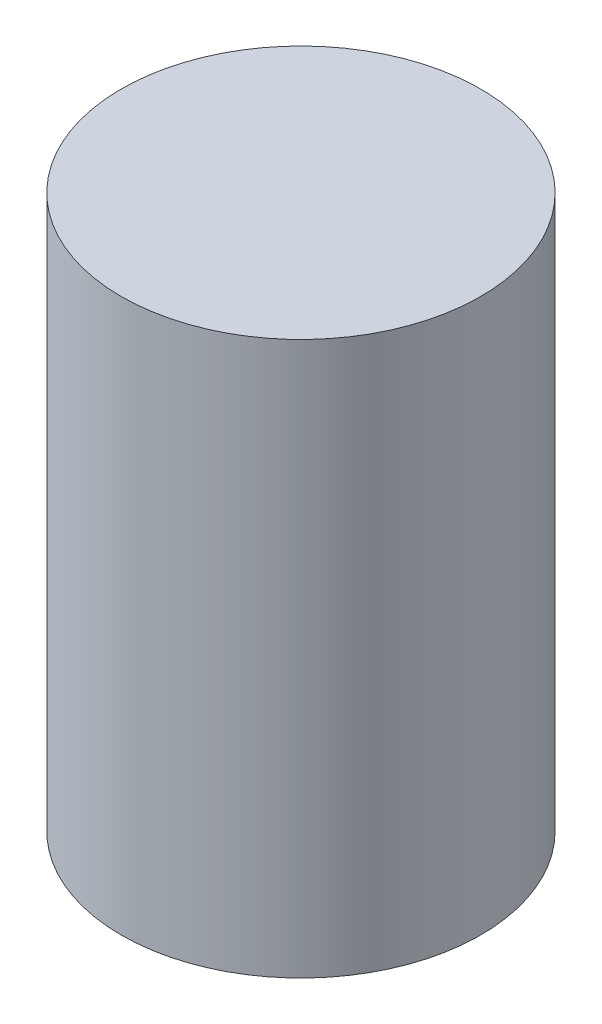
ISO-10303-21;
HEADER;
FILE_DESCRIPTION(('STEP AP214'),'2;1');
FILE_NAME('part.step','',(''),(''),'','','');
FILE_SCHEMA(('AUTOMOTIVE_DESIGN { 1 0 10303 214 1 1 1 1 }'));
ENDSEC;
DATA;
#1=APPLICATION_CONTEXT('core data for automotive mechanical design processes');
#2=APPLICATION_PROTOCOL_DEFINITION('international standard','automotive_design',2000,#1);
#3=PRODUCT_CONTEXT('',#1,'mechanical');
#4=PRODUCT('Part','Part','',(#3));
#5=PRODUCT_RELATED_PRODUCT_CATEGORY('part','',(#4));
#6=PRODUCT_DEFINITION_FORMATION('','',#4);
#7=PRODUCT_DEFINITION_CONTEXT('part definition',#1,'design');
#8=PRODUCT_DEFINITION('design','',#6,#7);
#9=PRODUCT_DEFINITION_SHAPE('','',#8);
#10=(LENGTH_UNIT() NAMED_UNIT(*) SI_UNIT(.MILLI.,.METRE.));
#11=(NAMED_UNIT(*) PLANE_ANGLE_UNIT() SI_UNIT($,.RADIAN.));
#12=(NAMED_UNIT(*) SI_UNIT($,.STERADIAN.) SOLID_ANGLE_UNIT());
#13=UNCERTAINTY_MEASURE_WITH_UNIT(LENGTH_MEASURE(1.E-05),#10,'distance_accuracy_value','');
#14=(GEOMETRIC_REPRESENTATION_CONTEXT(3) GLOBAL_UNCERTAINTY_ASSIGNED_CONTEXT((#13)) GLOBAL_UNIT_ASSIGNED_CONTEXT((#10,
#11,#12)) REPRESENTATION_CONTEXT('',''));
#15=CARTESIAN_POINT('',(0.,0.,0.));
#16=DIRECTION('',(0.,0.,1.));
#17=DIRECTION('',(1.,0.,0.));
#18=AXIS2_PLACEMENT_3D('',#15,#16,#17);
#19=CARTESIAN_POINT('',(0.,8.,0.));
#20=DIRECTION('',(0.,-1.,0.));
#21=DIRECTION('',(0.,0.,-1.));
#22=AXIS2_PLACEMENT_3D('',#19,#20,#21);
#23=CYLINDRICAL_SURFACE('',#22,2.6);
#24=CARTESIAN_POINT('',(0.,8.,0.));
#25=DIRECTION('',(0.,1.,0.));
#26=DIRECTION('',(0.,0.,1.));
#27=AXIS2_PLACEMENT_3D('',#24,#25,#26);
#28=CIRCLE('',#27,2.6);
#29=CARTESIAN_POINT('',(0.,8.,2.6));
#30=VERTEX_POINT('',#29);
#31=EDGE_CURVE('E10',#30,#30,#28,.T.);
#32=ORIENTED_EDGE('',*,*,#31,.F.);
#33=EDGE_LOOP('',(#32));
#34=FACE_BOUND('',#33,.T.);
#35=CARTESIAN_POINT('',(0.,0.,0.));
#36=DIRECTION('',(0.,1.,0.));
#37=DIRECTION('',(0.,0.,1.));
#38=AXIS2_PLACEMENT_3D('',#35,#36,#37);
#39=CIRCLE('',#38,2.6);
#40=CARTESIAN_POINT('',(0.,0.,2.6));
#41=VERTEX_POINT('',#40);
#42=EDGE_CURVE('E46',#41,#41,#39,.T.);
#43=ORIENTED_EDGE('',*,*,#42,.T.);
#44=EDGE_LOOP('',(#43));
#45=FACE_BOUND('',#44,.T.);
#46=ADVANCED_FACE('F43',(#34,#45),#23,.T.);
#47=CARTESIAN_POINT('',(0.,8.,0.));
#48=DIRECTION('',(0.,1.,0.));
#49=DIRECTION('',(0.,0.,1.));
#50=AXIS2_PLACEMENT_3D('',#47,#48,#49);
#51=PLANE('',#50);
#52=ORIENTED_EDGE('',*,*,#31,.T.);
#53=EDGE_LOOP('',(#52));
#54=FACE_BOUND('',#53,.T.);
#55=ADVANCED_FACE('F60',(#54),#51,.T.);
#56=CARTESIAN_POINT('',(0.,0.,0.));
#57=DIRECTION('',(0.,1.,0.));
#58=DIRECTION('',(0.,0.,1.));
#59=AXIS2_PLACEMENT_3D('',#56,#57,#58);
#60=PLANE('',#59);
#61=ORIENTED_EDGE('',*,*,#42,.F.);
#62=EDGE_LOOP('',(#61));
#63=FACE_BOUND('',#62,.T.);
#64=ADVANCED_FACE('F58',(#63),#60,.F.);
#65=CLOSED_SHELL('',(#46,#55,#64));
#66=MANIFOLD_SOLID_BREP('B2',#65);
#67=ADVANCED_BREP_SHAPE_REPRESENTATION('',(#18,#66),#14);
#68=SHAPE_DEFINITION_REPRESENTATION(#9,#67);
ENDSEC;
END-ISO-10303-21;
